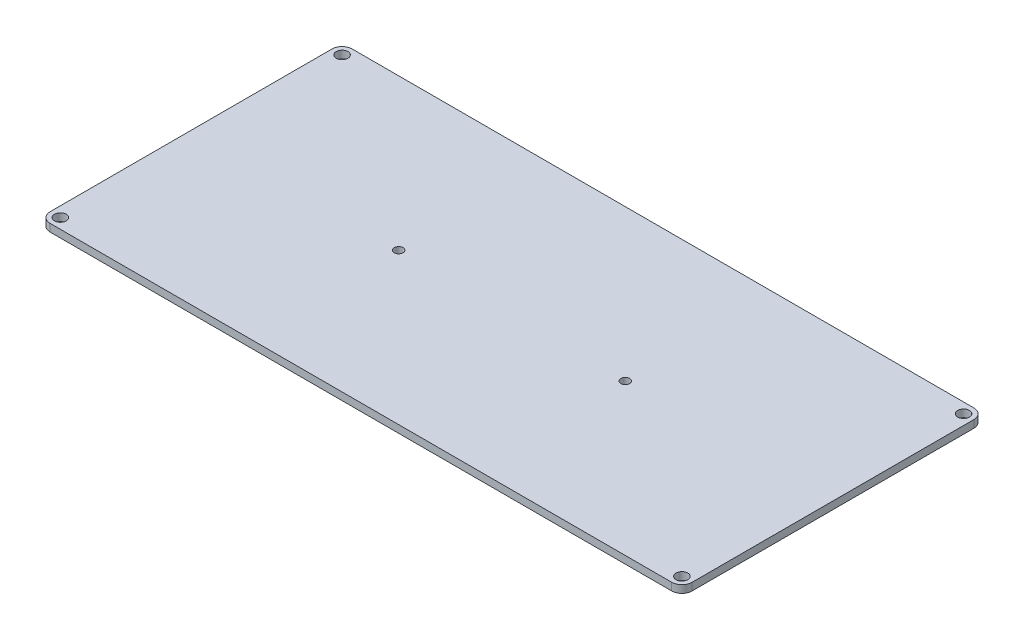
ISO-10303-21;
HEADER;
FILE_DESCRIPTION(('STEP AP214'),'2;1');
FILE_NAME('part.step','',(''),(''),'','','');
FILE_SCHEMA(('AUTOMOTIVE_DESIGN { 1 0 10303 214 1 1 1 1 }'));
ENDSEC;
DATA;
#1=APPLICATION_CONTEXT('core data for automotive mechanical design processes');
#2=APPLICATION_PROTOCOL_DEFINITION('international standard','automotive_design',2000,#1);
#3=PRODUCT_CONTEXT('',#1,'mechanical');
#4=PRODUCT('Part','Part','',(#3));
#5=PRODUCT_RELATED_PRODUCT_CATEGORY('part','',(#4));
#6=PRODUCT_DEFINITION_FORMATION('','',#4);
#7=PRODUCT_DEFINITION_CONTEXT('part definition',#1,'design');
#8=PRODUCT_DEFINITION('design','',#6,#7);
#9=PRODUCT_DEFINITION_SHAPE('','',#8);
#10=(LENGTH_UNIT() NAMED_UNIT(*) SI_UNIT(.MILLI.,.METRE.));
#11=(NAMED_UNIT(*) PLANE_ANGLE_UNIT() SI_UNIT($,.RADIAN.));
#12=(NAMED_UNIT(*) SI_UNIT($,.STERADIAN.) SOLID_ANGLE_UNIT());
#13=UNCERTAINTY_MEASURE_WITH_UNIT(LENGTH_MEASURE(1.E-05),#10,'distance_accuracy_value','');
#14=(GEOMETRIC_REPRESENTATION_CONTEXT(3) GLOBAL_UNCERTAINTY_ASSIGNED_CONTEXT((#13)) GLOBAL_UNIT_ASSIGNED_CONTEXT((#10,
#11,#12)) REPRESENTATION_CONTEXT('',''));
#15=CARTESIAN_POINT('',(0.,0.,0.));
#16=DIRECTION('',(0.,0.,1.));
#17=DIRECTION('',(1.,0.,0.));
#18=AXIS2_PLACEMENT_3D('',#15,#16,#17);
#19=CARTESIAN_POINT('',(0.,0.,0.));
#20=DIRECTION('',(0.,1.,0.));
#21=DIRECTION('',(0.,0.,1.));
#22=AXIS2_PLACEMENT_3D('',#19,#20,#21);
#23=PLANE('',#22);
#24=CARTESIAN_POINT('',(115.129065017703,0.,46.4833447776139));
#25=DIRECTION('',(0.,-1.,0.));
#26=DIRECTION('',(0.,0.,-1.));
#27=AXIS2_PLACEMENT_3D('',#24,#25,#26);
#28=CIRCLE('',#27,2.7);
#29=CARTESIAN_POINT('',(115.129065017703,0.,49.1833447776139));
#30=VERTEX_POINT('',#29);
#31=CARTESIAN_POINT('',(117.829065017703,0.,46.4833447776139));
#32=VERTEX_POINT('',#31);
#33=EDGE_CURVE('E87',#30,#32,#28,.F.);
#34=ORIENTED_EDGE('',*,*,#33,.F.);
#35=DIRECTION('',(-1.,0.,0.));
#36=VECTOR('',#35,1.);
#37=CARTESIAN_POINT('',(-52.1709349822968,0.,49.1833447776139));
#38=LINE('',#37,#36);
#39=CARTESIAN_POINT('',(-49.4709349822968,0.,49.1833447776139));
#40=VERTEX_POINT('',#39);
#41=EDGE_CURVE('E79',#30,#40,#38,.T.);
#42=ORIENTED_EDGE('',*,*,#41,.T.);
#43=CARTESIAN_POINT('',(-49.4709349822968,0.,46.4833447776139));
#44=DIRECTION('',(0.,-1.,0.));
#45=DIRECTION('',(0.,0.,-1.));
#46=AXIS2_PLACEMENT_3D('',#43,#44,#45);
#47=CIRCLE('',#46,2.7);
#48=CARTESIAN_POINT('',(-52.1709349822968,0.,46.4833447776139));
#49=VERTEX_POINT('',#48);
#50=EDGE_CURVE('E150',#49,#40,#47,.F.);
#51=ORIENTED_EDGE('',*,*,#50,.F.);
#52=DIRECTION('',(0.,0.,-1.));
#53=VECTOR('',#52,1.);
#54=CARTESIAN_POINT('',(-52.1709349822969,0.,-30.8166552223861));
#55=LINE('',#54,#53);
#56=CARTESIAN_POINT('',(-52.1709349822969,0.,-28.1166552223861));
#57=VERTEX_POINT('',#56);
#58=EDGE_CURVE('E114',#49,#57,#55,.T.);
#59=ORIENTED_EDGE('',*,*,#58,.T.);
#60=CARTESIAN_POINT('',(-49.4709349822969,0.,-28.1166552223861));
#61=DIRECTION('',(0.,-1.,0.));
#62=DIRECTION('',(0.,0.,-1.));
#63=AXIS2_PLACEMENT_3D('',#60,#61,#62);
#64=CIRCLE('',#63,2.7);
#65=CARTESIAN_POINT('',(-49.4709349822969,0.,-30.8166552223861));
#66=VERTEX_POINT('',#65);
#67=EDGE_CURVE('E153',#66,#57,#64,.F.);
#68=ORIENTED_EDGE('',*,*,#67,.F.);
#69=DIRECTION('',(1.,0.,0.));
#70=VECTOR('',#69,1.);
#71=CARTESIAN_POINT('',(-52.1709349822969,0.,-30.8166552223861));
#72=LINE('',#71,#70);
#73=CARTESIAN_POINT('',(115.129065017703,0.,-30.8166552223861));
#74=VERTEX_POINT('',#73);
#75=EDGE_CURVE('E118',#66,#74,#72,.T.);
#76=ORIENTED_EDGE('',*,*,#75,.T.);
#77=CARTESIAN_POINT('',(115.129065017703,0.,-28.1166552223861));
#78=DIRECTION('',(0.,-1.,0.));
#79=DIRECTION('',(0.,0.,-1.));
#80=AXIS2_PLACEMENT_3D('',#77,#78,#79);
#81=CIRCLE('',#80,2.7);
#82=CARTESIAN_POINT('',(117.829065017703,0.,-28.1166552223861));
#83=VERTEX_POINT('',#82);
#84=EDGE_CURVE('E90',#83,#74,#81,.F.);
#85=ORIENTED_EDGE('',*,*,#84,.F.);
#86=DIRECTION('',(0.,0.,1.));
#87=VECTOR('',#86,1.);
#88=CARTESIAN_POINT('',(117.829065017703,0.,-30.8166552223861));
#89=LINE('',#88,#87);
#90=EDGE_CURVE('E84',#83,#32,#89,.T.);
#91=ORIENTED_EDGE('',*,*,#90,.T.);
#92=EDGE_LOOP('',(#34,#42,#51,#59,#68,#76,#85,#91));
#93=FACE_BOUND('',#92,.T.);
#94=CARTESIAN_POINT('',(115.129065017703,0.,46.4833447776139));
#95=DIRECTION('',(0.,1.,0.));
#96=DIRECTION('',(0.,0.,1.));
#97=AXIS2_PLACEMENT_3D('',#94,#95,#96);
#98=CIRCLE('',#97,1.55);
#99=CARTESIAN_POINT('',(115.129065017703,0.,48.0333447776139));
#100=VERTEX_POINT('',#99);
#101=EDGE_CURVE('E113',#100,#100,#98,.T.);
#102=ORIENTED_EDGE('',*,*,#101,.T.);
#103=EDGE_LOOP('',(#102));
#104=FACE_BOUND('',#103,.T.);
#105=CARTESIAN_POINT('',(-49.4709349822969,0.,46.4833447776139));
#106=DIRECTION('',(0.,1.,0.));
#107=DIRECTION('',(0.,0.,1.));
#108=AXIS2_PLACEMENT_3D('',#105,#106,#107);
#109=CIRCLE('',#108,1.55);
#110=CARTESIAN_POINT('',(-49.4709349822969,0.,48.0333447776139));
#111=VERTEX_POINT('',#110);
#112=EDGE_CURVE('E159',#111,#111,#109,.T.);
#113=ORIENTED_EDGE('',*,*,#112,.T.);
#114=EDGE_LOOP('',(#113));
#115=FACE_BOUND('',#114,.T.);
#116=CARTESIAN_POINT('',(-49.4709349822969,0.,-28.1166552223861));
#117=DIRECTION('',(0.,1.,0.));
#118=DIRECTION('',(0.,0.,1.));
#119=AXIS2_PLACEMENT_3D('',#116,#117,#118);
#120=CIRCLE('',#119,1.55);
#121=CARTESIAN_POINT('',(-49.4709349822969,0.,-26.5666552223861));
#122=VERTEX_POINT('',#121);
#123=EDGE_CURVE('E162',#122,#122,#120,.T.);
#124=ORIENTED_EDGE('',*,*,#123,.T.);
#125=EDGE_LOOP('',(#124));
#126=FACE_BOUND('',#125,.T.);
#127=CARTESIAN_POINT('',(115.129065017703,0.,-28.1166552223861));
#128=DIRECTION('',(0.,1.,0.));
#129=DIRECTION('',(0.,0.,1.));
#130=AXIS2_PLACEMENT_3D('',#127,#128,#129);
#131=CIRCLE('',#130,1.55);
#132=CARTESIAN_POINT('',(115.129065017703,0.,-26.5666552223861));
#133=VERTEX_POINT('',#132);
#134=EDGE_CURVE('E165',#133,#133,#131,.T.);
#135=ORIENTED_EDGE('',*,*,#134,.T.);
#136=EDGE_LOOP('',(#135));
#137=FACE_BOUND('',#136,.T.);
#138=CARTESIAN_POINT('',(2.82906501770315,0.,9.18334477761387));
#139=DIRECTION('',(0.,1.,0.));
#140=DIRECTION('',(0.,0.,1.));
#141=AXIS2_PLACEMENT_3D('',#138,#139,#140);
#142=CIRCLE('',#141,1.175);
#143=CARTESIAN_POINT('',(2.82906501770315,0.,10.3583447776139));
#144=VERTEX_POINT('',#143);
#145=EDGE_CURVE('E167',#144,#144,#142,.T.);
#146=ORIENTED_EDGE('',*,*,#145,.T.);
#147=EDGE_LOOP('',(#146));
#148=FACE_BOUND('',#147,.T.);
#149=CARTESIAN_POINT('',(62.8290650177031,0.,9.18334477761387));
#150=DIRECTION('',(0.,1.,0.));
#151=DIRECTION('',(0.,0.,1.));
#152=AXIS2_PLACEMENT_3D('',#149,#150,#151);
#153=CIRCLE('',#152,1.175);
#154=CARTESIAN_POINT('',(62.8290650177031,0.,10.3583447776139));
#155=VERTEX_POINT('',#154);
#156=EDGE_CURVE('E21',#155,#155,#153,.T.);
#157=ORIENTED_EDGE('',*,*,#156,.T.);
#158=EDGE_LOOP('',(#157));
#159=FACE_BOUND('',#158,.T.);
#160=ADVANCED_FACE('F18',(#93,#104,#115,#126,#137,#148,#159),#23,.F.);
#161=CARTESIAN_POINT('',(62.8290650177031,0.,9.18334477761387));
#162=DIRECTION('',(0.,1.,0.));
#163=DIRECTION('',(0.,0.,1.));
#164=AXIS2_PLACEMENT_3D('',#161,#162,#163);
#165=CYLINDRICAL_SURFACE('',#164,1.175);
#166=CARTESIAN_POINT('',(62.8290650177031,2.,9.18334477761387));
#167=DIRECTION('',(0.,1.,0.));
#168=DIRECTION('',(0.,0.,1.));
#169=AXIS2_PLACEMENT_3D('',#166,#167,#168);
#170=CIRCLE('',#169,1.175);
#171=CARTESIAN_POINT('',(62.8290650177031,2.,10.3583447776139));
#172=VERTEX_POINT('',#171);
#173=EDGE_CURVE('E146',#172,#172,#170,.F.);
#174=ORIENTED_EDGE('',*,*,#173,.F.);
#175=EDGE_LOOP('',(#174));
#176=FACE_BOUND('',#175,.T.);
#177=ORIENTED_EDGE('',*,*,#156,.F.);
#178=EDGE_LOOP('',(#177));
#179=FACE_BOUND('',#178,.T.);
#180=ADVANCED_FACE('F175',(#176,#179),#165,.F.);
#181=CARTESIAN_POINT('',(2.82906501770315,0.,9.18334477761387));
#182=DIRECTION('',(0.,1.,0.));
#183=DIRECTION('',(0.,0.,1.));
#184=AXIS2_PLACEMENT_3D('',#181,#182,#183);
#185=CYLINDRICAL_SURFACE('',#184,1.175);
#186=CARTESIAN_POINT('',(2.82906501770315,2.,9.18334477761387));
#187=DIRECTION('',(0.,1.,0.));
#188=DIRECTION('',(0.,0.,1.));
#189=AXIS2_PLACEMENT_3D('',#186,#187,#188);
#190=CIRCLE('',#189,1.175);
#191=CARTESIAN_POINT('',(2.82906501770315,2.,10.3583447776139));
#192=VERTEX_POINT('',#191);
#193=EDGE_CURVE('E143',#192,#192,#190,.F.);
#194=ORIENTED_EDGE('',*,*,#193,.F.);
#195=EDGE_LOOP('',(#194));
#196=FACE_BOUND('',#195,.T.);
#197=ORIENTED_EDGE('',*,*,#145,.F.);
#198=EDGE_LOOP('',(#197));
#199=FACE_BOUND('',#198,.T.);
#200=ADVANCED_FACE('F177',(#196,#199),#185,.F.);
#201=CARTESIAN_POINT('',(115.129065017703,0.,-28.1166552223861));
#202=DIRECTION('',(0.,1.,0.));
#203=DIRECTION('',(0.,0.,1.));
#204=AXIS2_PLACEMENT_3D('',#201,#202,#203);
#205=CYLINDRICAL_SURFACE('',#204,1.55);
#206=CARTESIAN_POINT('',(115.129065017703,2.,-28.1166552223861));
#207=DIRECTION('',(0.,1.,0.));
#208=DIRECTION('',(0.,0.,1.));
#209=AXIS2_PLACEMENT_3D('',#206,#207,#208);
#210=CIRCLE('',#209,1.55);
#211=CARTESIAN_POINT('',(115.129065017703,2.,-26.5666552223861));
#212=VERTEX_POINT('',#211);
#213=EDGE_CURVE('E140',#212,#212,#210,.F.);
#214=ORIENTED_EDGE('',*,*,#213,.F.);
#215=EDGE_LOOP('',(#214));
#216=FACE_BOUND('',#215,.T.);
#217=ORIENTED_EDGE('',*,*,#134,.F.);
#218=EDGE_LOOP('',(#217));
#219=FACE_BOUND('',#218,.T.);
#220=ADVANCED_FACE('F184',(#216,#219),#205,.F.);
#221=CARTESIAN_POINT('',(-49.4709349822969,0.,-28.1166552223861));
#222=DIRECTION('',(0.,1.,0.));
#223=DIRECTION('',(0.,0.,1.));
#224=AXIS2_PLACEMENT_3D('',#221,#222,#223);
#225=CYLINDRICAL_SURFACE('',#224,1.55);
#226=CARTESIAN_POINT('',(-49.4709349822969,2.,-28.1166552223861));
#227=DIRECTION('',(0.,1.,0.));
#228=DIRECTION('',(0.,0.,1.));
#229=AXIS2_PLACEMENT_3D('',#226,#227,#228);
#230=CIRCLE('',#229,1.55);
#231=CARTESIAN_POINT('',(-49.4709349822969,2.,-26.5666552223861));
#232=VERTEX_POINT('',#231);
#233=EDGE_CURVE('E137',#232,#232,#230,.F.);
#234=ORIENTED_EDGE('',*,*,#233,.F.);
#235=EDGE_LOOP('',(#234));
#236=FACE_BOUND('',#235,.T.);
#237=ORIENTED_EDGE('',*,*,#123,.F.);
#238=EDGE_LOOP('',(#237));
#239=FACE_BOUND('',#238,.T.);
#240=ADVANCED_FACE('F230',(#236,#239),#225,.F.);
#241=CARTESIAN_POINT('',(-49.4709349822969,0.,46.4833447776139));
#242=DIRECTION('',(0.,1.,0.));
#243=DIRECTION('',(0.,0.,1.));
#244=AXIS2_PLACEMENT_3D('',#241,#242,#243);
#245=CYLINDRICAL_SURFACE('',#244,1.55);
#246=CARTESIAN_POINT('',(-49.4709349822969,2.,46.4833447776139));
#247=DIRECTION('',(0.,1.,0.));
#248=DIRECTION('',(0.,0.,1.));
#249=AXIS2_PLACEMENT_3D('',#246,#247,#248);
#250=CIRCLE('',#249,1.55);
#251=CARTESIAN_POINT('',(-49.4709349822969,2.,48.0333447776139));
#252=VERTEX_POINT('',#251);
#253=EDGE_CURVE('E134',#252,#252,#250,.F.);
#254=ORIENTED_EDGE('',*,*,#253,.F.);
#255=EDGE_LOOP('',(#254));
#256=FACE_BOUND('',#255,.T.);
#257=ORIENTED_EDGE('',*,*,#112,.F.);
#258=EDGE_LOOP('',(#257));
#259=FACE_BOUND('',#258,.T.);
#260=ADVANCED_FACE('F226',(#256,#259),#245,.F.);
#261=CARTESIAN_POINT('',(115.129065017703,0.,46.4833447776139));
#262=DIRECTION('',(0.,1.,0.));
#263=DIRECTION('',(0.,0.,1.));
#264=AXIS2_PLACEMENT_3D('',#261,#262,#263);
#265=CYLINDRICAL_SURFACE('',#264,1.55);
#266=CARTESIAN_POINT('',(115.129065017703,2.,46.4833447776139));
#267=DIRECTION('',(0.,1.,0.));
#268=DIRECTION('',(0.,0.,1.));
#269=AXIS2_PLACEMENT_3D('',#266,#267,#268);
#270=CIRCLE('',#269,1.55);
#271=CARTESIAN_POINT('',(115.129065017703,2.,48.0333447776139));
#272=VERTEX_POINT('',#271);
#273=EDGE_CURVE('E131',#272,#272,#270,.F.);
#274=ORIENTED_EDGE('',*,*,#273,.F.);
#275=EDGE_LOOP('',(#274));
#276=FACE_BOUND('',#275,.T.);
#277=ORIENTED_EDGE('',*,*,#101,.F.);
#278=EDGE_LOOP('',(#277));
#279=FACE_BOUND('',#278,.T.);
#280=ADVANCED_FACE('F223',(#276,#279),#265,.F.);
#281=CARTESIAN_POINT('',(-52.1709349822968,2.,49.1833447776139));
#282=DIRECTION('',(0.,0.,-1.));
#283=DIRECTION('',(-1.,0.,0.));
#284=AXIS2_PLACEMENT_3D('',#281,#282,#283);
#285=PLANE('',#284);
#286=DIRECTION('',(0.,-1.,0.));
#287=VECTOR('',#286,1.);
#288=CARTESIAN_POINT('',(115.129065017703,2.,49.1833447776139));
#289=LINE('',#288,#287);
#290=CARTESIAN_POINT('',(115.129065017703,2.,49.1833447776139));
#291=VERTEX_POINT('',#290);
#292=EDGE_CURVE('E100',#291,#30,#289,.T.);
#293=ORIENTED_EDGE('',*,*,#292,.F.);
#294=DIRECTION('',(1.,0.,0.));
#295=VECTOR('',#294,1.);
#296=CARTESIAN_POINT('',(0.,2.,49.1833447776139));
#297=LINE('',#296,#295);
#298=CARTESIAN_POINT('',(-49.4709349822968,2.,49.1833447776139));
#299=VERTEX_POINT('',#298);
#300=EDGE_CURVE('E130',#299,#291,#297,.T.);
#301=ORIENTED_EDGE('',*,*,#300,.F.);
#302=DIRECTION('',(0.,-1.,0.));
#303=VECTOR('',#302,1.);
#304=CARTESIAN_POINT('',(-49.4709349822968,2.,49.1833447776139));
#305=LINE('',#304,#303);
#306=EDGE_CURVE('E149',#40,#299,#305,.F.);
#307=ORIENTED_EDGE('',*,*,#306,.F.);
#308=ORIENTED_EDGE('',*,*,#41,.F.);
#309=EDGE_LOOP('',(#293,#301,#307,#308));
#310=FACE_BOUND('',#309,.T.);
#311=ADVANCED_FACE('F220',(#310),#285,.F.);
#312=CARTESIAN_POINT('',(115.129065017703,2.,46.4833447776139));
#313=DIRECTION('',(0.,-1.,0.));
#314=DIRECTION('',(0.,0.,-1.));
#315=AXIS2_PLACEMENT_3D('',#312,#313,#314);
#316=CYLINDRICAL_SURFACE('',#315,2.7);
#317=ORIENTED_EDGE('',*,*,#33,.T.);
#318=DIRECTION('',(0.,1.,0.));
#319=VECTOR('',#318,1.);
#320=CARTESIAN_POINT('',(117.829065017703,2.,46.4833447776139));
#321=LINE('',#320,#319);
#322=CARTESIAN_POINT('',(117.829065017703,2.,46.4833447776139));
#323=VERTEX_POINT('',#322);
#324=EDGE_CURVE('E94',#32,#323,#321,.T.);
#325=ORIENTED_EDGE('',*,*,#324,.T.);
#326=CARTESIAN_POINT('',(115.129065017703,2.,46.4833447776139));
#327=DIRECTION('',(0.,-1.,0.));
#328=DIRECTION('',(0.,0.,-1.));
#329=AXIS2_PLACEMENT_3D('',#326,#327,#328);
#330=CIRCLE('',#329,2.7);
#331=EDGE_CURVE('E128',#291,#323,#330,.F.);
#332=ORIENTED_EDGE('',*,*,#331,.F.);
#333=ORIENTED_EDGE('',*,*,#292,.T.);
#334=EDGE_LOOP('',(#317,#325,#332,#333));
#335=FACE_BOUND('',#334,.T.);
#336=ADVANCED_FACE('F97',(#335),#316,.T.);
#337=CARTESIAN_POINT('',(117.829065017703,2.,-30.8166552223861));
#338=DIRECTION('',(-1.,0.,0.));
#339=DIRECTION('',(0.,0.,1.));
#340=AXIS2_PLACEMENT_3D('',#337,#338,#339);
#341=PLANE('',#340);
#342=ORIENTED_EDGE('',*,*,#324,.F.);
#343=ORIENTED_EDGE('',*,*,#90,.F.);
#344=DIRECTION('',(0.,-1.,0.));
#345=VECTOR('',#344,1.);
#346=CARTESIAN_POINT('',(117.829065017703,2.,-28.1166552223861));
#347=LINE('',#346,#345);
#348=CARTESIAN_POINT('',(117.829065017703,2.,-28.1166552223861));
#349=VERTEX_POINT('',#348);
#350=EDGE_CURVE('E106',#349,#83,#347,.T.);
#351=ORIENTED_EDGE('',*,*,#350,.F.);
#352=DIRECTION('',(0.,0.,1.));
#353=VECTOR('',#352,1.);
#354=CARTESIAN_POINT('',(117.829065017703,2.,0.));
#355=LINE('',#354,#353);
#356=EDGE_CURVE('E104',#323,#349,#355,.F.);
#357=ORIENTED_EDGE('',*,*,#356,.F.);
#358=EDGE_LOOP('',(#342,#343,#351,#357));
#359=FACE_BOUND('',#358,.T.);
#360=ADVANCED_FACE('F102',(#359),#341,.F.);
#361=CARTESIAN_POINT('',(115.129065017703,2.,-28.1166552223861));
#362=DIRECTION('',(0.,-1.,0.));
#363=DIRECTION('',(0.,0.,-1.));
#364=AXIS2_PLACEMENT_3D('',#361,#362,#363);
#365=CYLINDRICAL_SURFACE('',#364,2.7);
#366=ORIENTED_EDGE('',*,*,#84,.T.);
#367=DIRECTION('',(0.,1.,0.));
#368=VECTOR('',#367,1.);
#369=CARTESIAN_POINT('',(115.129065017703,2.,-30.8166552223861));
#370=LINE('',#369,#368);
#371=CARTESIAN_POINT('',(115.129065017703,2.,-30.8166552223861));
#372=VERTEX_POINT('',#371);
#373=EDGE_CURVE('E119',#74,#372,#370,.T.);
#374=ORIENTED_EDGE('',*,*,#373,.T.);
#375=CARTESIAN_POINT('',(115.129065017703,2.,-28.1166552223861));
#376=DIRECTION('',(0.,-1.,0.));
#377=DIRECTION('',(0.,0.,-1.));
#378=AXIS2_PLACEMENT_3D('',#375,#376,#377);
#379=CIRCLE('',#378,2.7);
#380=EDGE_CURVE('E125',#349,#372,#379,.F.);
#381=ORIENTED_EDGE('',*,*,#380,.F.);
#382=ORIENTED_EDGE('',*,*,#350,.T.);
#383=EDGE_LOOP('',(#366,#374,#381,#382));
#384=FACE_BOUND('',#383,.T.);
#385=ADVANCED_FACE('F211',(#384),#365,.T.);
#386=CARTESIAN_POINT('',(-52.1709349822969,2.,-30.8166552223861));
#387=DIRECTION('',(0.,0.,1.));
#388=DIRECTION('',(1.,0.,0.));
#389=AXIS2_PLACEMENT_3D('',#386,#387,#388);
#390=PLANE('',#389);
#391=ORIENTED_EDGE('',*,*,#373,.F.);
#392=ORIENTED_EDGE('',*,*,#75,.F.);
#393=DIRECTION('',(0.,-1.,0.));
#394=VECTOR('',#393,1.);
#395=CARTESIAN_POINT('',(-49.4709349822969,2.,-30.8166552223861));
#396=LINE('',#395,#394);
#397=CARTESIAN_POINT('',(-49.4709349822969,2.,-30.8166552223861));
#398=VERTEX_POINT('',#397);
#399=EDGE_CURVE('E155',#398,#66,#396,.T.);
#400=ORIENTED_EDGE('',*,*,#399,.F.);
#401=DIRECTION('',(1.,0.,0.));
#402=VECTOR('',#401,1.);
#403=CARTESIAN_POINT('',(0.,2.,-30.8166552223861));
#404=LINE('',#403,#402);
#405=EDGE_CURVE('E124',#372,#398,#404,.F.);
#406=ORIENTED_EDGE('',*,*,#405,.F.);
#407=EDGE_LOOP('',(#391,#392,#400,#406));
#408=FACE_BOUND('',#407,.T.);
#409=ADVANCED_FACE('F207',(#408),#390,.F.);
#410=CARTESIAN_POINT('',(-49.4709349822969,2.,-28.1166552223861));
#411=DIRECTION('',(0.,-1.,0.));
#412=DIRECTION('',(0.,0.,-1.));
#413=AXIS2_PLACEMENT_3D('',#410,#411,#412);
#414=CYLINDRICAL_SURFACE('',#413,2.7);
#415=ORIENTED_EDGE('',*,*,#67,.T.);
#416=DIRECTION('',(0.,1.,0.));
#417=VECTOR('',#416,1.);
#418=CARTESIAN_POINT('',(-52.1709349822969,2.,-28.1166552223861));
#419=LINE('',#418,#417);
#420=CARTESIAN_POINT('',(-52.1709349822969,2.,-28.1166552223861));
#421=VERTEX_POINT('',#420);
#422=EDGE_CURVE('E117',#57,#421,#419,.T.);
#423=ORIENTED_EDGE('',*,*,#422,.T.);
#424=CARTESIAN_POINT('',(-49.4709349822969,2.,-28.1166552223861));
#425=DIRECTION('',(0.,-1.,0.));
#426=DIRECTION('',(0.,0.,-1.));
#427=AXIS2_PLACEMENT_3D('',#424,#425,#426);
#428=CIRCLE('',#427,2.7);
#429=EDGE_CURVE('E121',#398,#421,#428,.F.);
#430=ORIENTED_EDGE('',*,*,#429,.F.);
#431=ORIENTED_EDGE('',*,*,#399,.T.);
#432=EDGE_LOOP('',(#415,#423,#430,#431));
#433=FACE_BOUND('',#432,.T.);
#434=ADVANCED_FACE('F204',(#433),#414,.T.);
#435=CARTESIAN_POINT('',(-52.1709349822969,2.,-30.8166552223861));
#436=DIRECTION('',(1.,0.,0.));
#437=DIRECTION('',(0.,0.,-1.));
#438=AXIS2_PLACEMENT_3D('',#435,#436,#437);
#439=PLANE('',#438);
#440=DIRECTION('',(0.,-1.,0.));
#441=VECTOR('',#440,1.);
#442=CARTESIAN_POINT('',(-52.1709349822968,2.,46.4833447776139));
#443=LINE('',#442,#441);
#444=CARTESIAN_POINT('',(-52.1709349822968,2.,46.4833447776139));
#445=VERTEX_POINT('',#444);
#446=EDGE_CURVE('E36',#445,#49,#443,.T.);
#447=ORIENTED_EDGE('',*,*,#446,.F.);
#448=DIRECTION('',(0.,0.,1.));
#449=VECTOR('',#448,1.);
#450=CARTESIAN_POINT('',(-52.1709349822969,2.,0.));
#451=LINE('',#450,#449);
#452=EDGE_CURVE('E27',#421,#445,#451,.T.);
#453=ORIENTED_EDGE('',*,*,#452,.F.);
#454=ORIENTED_EDGE('',*,*,#422,.F.);
#455=ORIENTED_EDGE('',*,*,#58,.F.);
#456=EDGE_LOOP('',(#447,#453,#454,#455));
#457=FACE_BOUND('',#456,.T.);
#458=ADVANCED_FACE('F196',(#457),#439,.F.);
#459=CARTESIAN_POINT('',(-49.4709349822968,2.,46.4833447776139));
#460=DIRECTION('',(0.,-1.,0.));
#461=DIRECTION('',(0.,0.,-1.));
#462=AXIS2_PLACEMENT_3D('',#459,#460,#461);
#463=CYLINDRICAL_SURFACE('',#462,2.7);
#464=ORIENTED_EDGE('',*,*,#50,.T.);
#465=ORIENTED_EDGE('',*,*,#306,.T.);
#466=CARTESIAN_POINT('',(-49.4709349822968,2.,46.4833447776139));
#467=DIRECTION('',(0.,-1.,0.));
#468=DIRECTION('',(0.,0.,-1.));
#469=AXIS2_PLACEMENT_3D('',#466,#467,#468);
#470=CIRCLE('',#469,2.7);
#471=EDGE_CURVE('E11',#445,#299,#470,.F.);
#472=ORIENTED_EDGE('',*,*,#471,.F.);
#473=ORIENTED_EDGE('',*,*,#446,.T.);
#474=EDGE_LOOP('',(#464,#465,#472,#473));
#475=FACE_BOUND('',#474,.T.);
#476=ADVANCED_FACE('F190',(#475),#463,.T.);
#477=CARTESIAN_POINT('',(0.,2.,0.));
#478=DIRECTION('',(0.,1.,0.));
#479=DIRECTION('',(0.,0.,1.));
#480=AXIS2_PLACEMENT_3D('',#477,#478,#479);
#481=PLANE('',#480);
#482=ORIENTED_EDGE('',*,*,#452,.T.);
#483=ORIENTED_EDGE('',*,*,#471,.T.);
#484=ORIENTED_EDGE('',*,*,#300,.T.);
#485=ORIENTED_EDGE('',*,*,#331,.T.);
#486=ORIENTED_EDGE('',*,*,#356,.T.);
#487=ORIENTED_EDGE('',*,*,#380,.T.);
#488=ORIENTED_EDGE('',*,*,#405,.T.);
#489=ORIENTED_EDGE('',*,*,#429,.T.);
#490=EDGE_LOOP('',(#482,#483,#484,#485,#486,#487,#488,#489));
#491=FACE_BOUND('',#490,.T.);
#492=ORIENTED_EDGE('',*,*,#273,.T.);
#493=EDGE_LOOP('',(#492));
#494=FACE_BOUND('',#493,.T.);
#495=ORIENTED_EDGE('',*,*,#253,.T.);
#496=EDGE_LOOP('',(#495));
#497=FACE_BOUND('',#496,.T.);
#498=ORIENTED_EDGE('',*,*,#233,.T.);
#499=EDGE_LOOP('',(#498));
#500=FACE_BOUND('',#499,.T.);
#501=ORIENTED_EDGE('',*,*,#213,.T.);
#502=EDGE_LOOP('',(#501));
#503=FACE_BOUND('',#502,.T.);
#504=ORIENTED_EDGE('',*,*,#193,.T.);
#505=EDGE_LOOP('',(#504));
#506=FACE_BOUND('',#505,.T.);
#507=ORIENTED_EDGE('',*,*,#173,.T.);
#508=EDGE_LOOP('',(#507));
#509=FACE_BOUND('',#508,.T.);
#510=ADVANCED_FACE('F188',(#491,#494,#497,#500,#503,#506,#509),#481,.T.);
#511=CLOSED_SHELL('',(#160,#180,#200,#220,#240,#260,#280,#311,#336,#360,#385,#409,#434,#458,
#476,#510));
#512=MANIFOLD_SOLID_BREP('B1',#511);
#513=ADVANCED_BREP_SHAPE_REPRESENTATION('',(#18,#512),#14);
#514=SHAPE_DEFINITION_REPRESENTATION(#9,#513);
ENDSEC;
END-ISO-10303-21;
